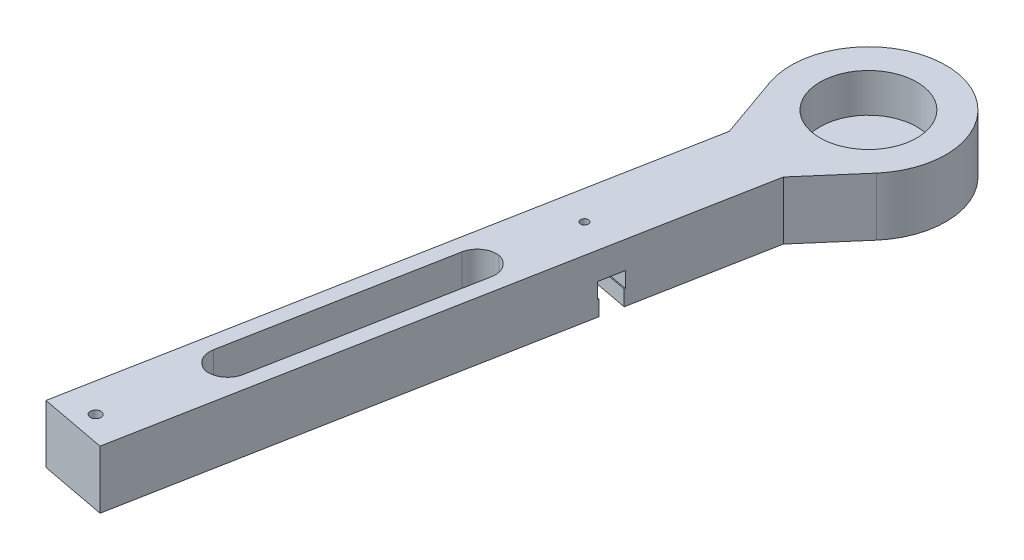
ISO-10303-21;
HEADER;
FILE_DESCRIPTION(('STEP AP214'),'2;1');
FILE_NAME('part.step','',(''),(''),'','','');
FILE_SCHEMA(('AUTOMOTIVE_DESIGN { 1 0 10303 214 1 1 1 1 }'));
ENDSEC;
DATA;
#1=APPLICATION_CONTEXT('core data for automotive mechanical design processes');
#2=APPLICATION_PROTOCOL_DEFINITION('international standard','automotive_design',2000,#1);
#3=PRODUCT_CONTEXT('',#1,'mechanical');
#4=PRODUCT('Part','Part','',(#3));
#5=PRODUCT_RELATED_PRODUCT_CATEGORY('part','',(#4));
#6=PRODUCT_DEFINITION_FORMATION('','',#4);
#7=PRODUCT_DEFINITION_CONTEXT('part definition',#1,'design');
#8=PRODUCT_DEFINITION('design','',#6,#7);
#9=PRODUCT_DEFINITION_SHAPE('','',#8);
#10=(LENGTH_UNIT() NAMED_UNIT(*) SI_UNIT(.MILLI.,.METRE.));
#11=(NAMED_UNIT(*) PLANE_ANGLE_UNIT() SI_UNIT($,.RADIAN.));
#12=(NAMED_UNIT(*) SI_UNIT($,.STERADIAN.) SOLID_ANGLE_UNIT());
#13=UNCERTAINTY_MEASURE_WITH_UNIT(LENGTH_MEASURE(1.E-05),#10,'distance_accuracy_value','');
#14=(GEOMETRIC_REPRESENTATION_CONTEXT(3) GLOBAL_UNCERTAINTY_ASSIGNED_CONTEXT((#13)) GLOBAL_UNIT_ASSIGNED_CONTEXT((#10,
#11,#12)) REPRESENTATION_CONTEXT('',''));
#15=CARTESIAN_POINT('',(0.,0.,0.));
#16=DIRECTION('',(0.,0.,1.));
#17=DIRECTION('',(1.,0.,0.));
#18=AXIS2_PLACEMENT_3D('',#15,#16,#17);
#19=CARTESIAN_POINT('',(-236.612399312574,147.4,-18.5069319913055));
#20=DIRECTION('',(0.,-1.,0.));
#21=DIRECTION('',(-0.982620152551214,0.,-0.185627680587325));
#22=AXIS2_PLACEMENT_3D('',#19,#20,#21);
#23=CYLINDRICAL_SURFACE('',#22,5.6);
#24=DIRECTION('',(0.,-1.,0.));
#25=VECTOR('',#24,1.);
#26=CARTESIAN_POINT('',(-237.651914323863,125.4,-13.0042591370187));
#27=LINE('',#26,#25);
#28=CARTESIAN_POINT('',(-237.651914323863,125.4,-13.0042591370187));
#29=VERTEX_POINT('',#28);
#30=CARTESIAN_POINT('',(-237.651914323863,117.4,-13.0042591370186));
#31=VERTEX_POINT('',#30);
#32=EDGE_CURVE('E315',#29,#31,#27,.T.);
#33=ORIENTED_EDGE('',*,*,#32,.T.);
#34=CARTESIAN_POINT('',(-236.612399312574,117.4,-18.5069319913054));
#35=DIRECTION('',(0.,-1.,0.));
#36=DIRECTION('',(-0.982620152551214,0.,-0.185627680587325));
#37=AXIS2_PLACEMENT_3D('',#34,#35,#36);
#38=CIRCLE('',#37,5.6);
#39=CARTESIAN_POINT('',(-235.572884301285,117.4,-24.0096048455922));
#40=VERTEX_POINT('',#39);
#41=EDGE_CURVE('E375',#31,#40,#38,.T.);
#42=ORIENTED_EDGE('',*,*,#41,.T.);
#43=DIRECTION('',(0.,1.,0.));
#44=VECTOR('',#43,1.);
#45=CARTESIAN_POINT('',(-235.572884301285,117.4,-24.0096048455922));
#46=LINE('',#45,#44);
#47=CARTESIAN_POINT('',(-235.572884301285,125.4,-24.0096048455923));
#48=VERTEX_POINT('',#47);
#49=EDGE_CURVE('E318',#40,#48,#46,.T.);
#50=ORIENTED_EDGE('',*,*,#49,.T.);
#51=CARTESIAN_POINT('',(-236.612399312574,125.4,-18.5069319913055));
#52=DIRECTION('',(0.,1.,0.));
#53=DIRECTION('',(0.982620152551214,0.,0.185627680587325));
#54=AXIS2_PLACEMENT_3D('',#51,#52,#53);
#55=CIRCLE('',#54,5.6);
#56=EDGE_CURVE('E369',#29,#48,#55,.F.);
#57=ORIENTED_EDGE('',*,*,#56,.F.);
#58=EDGE_LOOP('',(#33,#42,#50,#57));
#59=FACE_BOUND('',#58,.T.);
#60=ADVANCED_FACE('F15',(#59),#23,.F.);
#61=CARTESIAN_POINT('',(-261.368402455663,147.400000000001,206.813706895547));
#62=DIRECTION('',(-0.185627680587325,0.,0.982620152551214));
#63=DIRECTION('',(0.982620152551214,0.,0.185627680587325));
#64=AXIS2_PLACEMENT_3D('',#61,#62,#63);
#65=PLANE('',#64);
#66=DIRECTION('',(-0.982620152551214,0.,-0.185627680587325));
#67=VECTOR('',#66,1.);
#68=CARTESIAN_POINT('',(-261.368402455663,117.400000000001,206.813706895547));
#69=LINE('',#68,#67);
#70=CARTESIAN_POINT('',(-261.368402455663,117.400000000001,206.813706895547));
#71=VERTEX_POINT('',#70);
#72=CARTESIAN_POINT('',(-295.760107794956,117.400000000001,200.316738074991));
#73=VERTEX_POINT('',#72);
#74=EDGE_CURVE('E378',#71,#73,#69,.T.);
#75=ORIENTED_EDGE('',*,*,#74,.F.);
#76=DIRECTION('',(0.,-1.,0.));
#77=VECTOR('',#76,1.);
#78=CARTESIAN_POINT('',(-261.368402455663,147.400000000001,206.813706895547));
#79=LINE('',#78,#77);
#80=CARTESIAN_POINT('',(-261.368402455663,147.400000000001,206.813706895547));
#81=VERTEX_POINT('',#80);
#82=EDGE_CURVE('E391',#81,#71,#79,.T.);
#83=ORIENTED_EDGE('',*,*,#82,.F.);
#84=DIRECTION('',(-0.982620152551214,0.,-0.185627680587325));
#85=VECTOR('',#84,1.);
#86=CARTESIAN_POINT('',(-261.368402455663,147.400000000001,206.813706895547));
#87=LINE('',#86,#85);
#88=CARTESIAN_POINT('',(-295.760107794956,147.400000000001,200.316738074991));
#89=VERTEX_POINT('',#88);
#90=EDGE_CURVE('E379',#81,#89,#87,.T.);
#91=ORIENTED_EDGE('',*,*,#90,.T.);
#92=DIRECTION('',(0.,-1.,0.));
#93=VECTOR('',#92,1.);
#94=CARTESIAN_POINT('',(-295.760107794956,147.400000000001,200.316738074991));
#95=LINE('',#94,#93);
#96=EDGE_CURVE('E386',#89,#73,#95,.T.);
#97=ORIENTED_EDGE('',*,*,#96,.T.);
#98=EDGE_LOOP('',(#75,#83,#91,#97));
#99=FACE_BOUND('',#98,.T.);
#100=ADVANCED_FACE('F466',(#99),#65,.T.);
#101=CARTESIAN_POINT('',(-261.368402455663,147.400000000001,206.813706895547));
#102=DIRECTION('',(-0.982620152551214,0.,-0.185627680587325));
#103=DIRECTION('',(-0.185627680587325,0.,0.982620152551214));
#104=AXIS2_PLACEMENT_3D('',#101,#102,#103);
#105=PLANE('',#104);
#106=DIRECTION('',(0.185627680587325,0.,-0.982620152551214));
#107=VECTOR('',#106,1.);
#108=CARTESIAN_POINT('',(-218.377031631639,125.4,-20.7611204353141));
#109=LINE('',#108,#107);
#110=CARTESIAN_POINT('',(-218.377031631639,125.4,-20.7611204353141));
#111=VERTEX_POINT('',#110);
#112=CARTESIAN_POINT('',(-218.284217791345,125.4,-21.2524305115897));
#113=VERTEX_POINT('',#112);
#114=EDGE_CURVE('E332',#111,#113,#109,.T.);
#115=ORIENTED_EDGE('',*,*,#114,.F.);
#116=DIRECTION('',(0.,1.,0.));
#117=VECTOR('',#116,1.);
#118=CARTESIAN_POINT('',(-218.377031631639,117.4,-20.7611204353141));
#119=LINE('',#118,#117);
#120=CARTESIAN_POINT('',(-218.377031631639,117.4,-20.7611204353141));
#121=VERTEX_POINT('',#120);
#122=EDGE_CURVE('E204',#121,#111,#119,.T.);
#123=ORIENTED_EDGE('',*,*,#122,.F.);
#124=DIRECTION('',(0.185627680587325,0.,-0.982620152551214));
#125=VECTOR('',#124,1.);
#126=CARTESIAN_POINT('',(-261.368402455663,117.400000000001,206.813706895547));
#127=LINE('',#126,#125);
#128=CARTESIAN_POINT('',(-205.308842918292,117.4,-89.9375791749195));
#129=VERTEX_POINT('',#128);
#130=EDGE_CURVE('E196',#121,#129,#127,.T.);
#131=ORIENTED_EDGE('',*,*,#130,.T.);
#132=DIRECTION('',(0.,-1.,0.));
#133=VECTOR('',#132,1.);
#134=CARTESIAN_POINT('',(-205.308842918291,147.4,-89.9375791749196));
#135=LINE('',#134,#133);
#136=CARTESIAN_POINT('',(-205.308842918291,147.4,-89.9375791749196));
#137=VERTEX_POINT('',#136);
#138=EDGE_CURVE('E201',#137,#129,#135,.T.);
#139=ORIENTED_EDGE('',*,*,#138,.F.);
#140=DIRECTION('',(0.185627680587325,0.,-0.982620152551214));
#141=VECTOR('',#140,1.);
#142=CARTESIAN_POINT('',(-261.368402455663,147.400000000001,206.813706895547));
#143=LINE('',#142,#141);
#144=EDGE_CURVE('E384',#81,#137,#143,.T.);
#145=ORIENTED_EDGE('',*,*,#144,.F.);
#146=ORIENTED_EDGE('',*,*,#82,.T.);
#147=CARTESIAN_POINT('',(-220.456061654217,117.4,-9.75577472674047));
#148=VERTEX_POINT('',#147);
#149=EDGE_CURVE('E208',#71,#148,#127,.T.);
#150=ORIENTED_EDGE('',*,*,#149,.T.);
#151=DIRECTION('',(0.,-1.,0.));
#152=VECTOR('',#151,1.);
#153=CARTESIAN_POINT('',(-220.456061654217,125.4,-9.75577472674049));
#154=LINE('',#153,#152);
#155=CARTESIAN_POINT('',(-220.456061654217,125.4,-9.75577472674049));
#156=VERTEX_POINT('',#155);
#157=EDGE_CURVE('E329',#156,#148,#154,.T.);
#158=ORIENTED_EDGE('',*,*,#157,.F.);
#159=DIRECTION('',(0.185627680587325,0.,-0.982620152551214));
#160=VECTOR('',#159,1.);
#161=CARTESIAN_POINT('',(-220.548875494511,125.4,-9.26446465046488));
#162=LINE('',#161,#160);
#163=CARTESIAN_POINT('',(-220.548875494511,125.4,-9.26446465046488));
#164=VERTEX_POINT('',#163);
#165=EDGE_CURVE('E326',#164,#156,#162,.T.);
#166=ORIENTED_EDGE('',*,*,#165,.F.);
#167=DIRECTION('',(0.,-1.,0.));
#168=VECTOR('',#167,1.);
#169=CARTESIAN_POINT('',(-220.548875494511,125.4,-9.26446465046488));
#170=LINE('',#169,#168);
#171=CARTESIAN_POINT('',(-220.548875494511,133.4,-9.26446465046489));
#172=VERTEX_POINT('',#171);
#173=EDGE_CURVE('E323',#172,#164,#170,.T.);
#174=ORIENTED_EDGE('',*,*,#173,.F.);
#175=DIRECTION('',(-0.185627680587325,0.,0.982620152551214));
#176=VECTOR('',#175,1.);
#177=CARTESIAN_POINT('',(-219.416546642928,133.4,-15.2584475810273));
#178=LINE('',#177,#176);
#179=CARTESIAN_POINT('',(-218.284217791345,133.4,-21.2524305115897));
#180=VERTEX_POINT('',#179);
#181=EDGE_CURVE('E319',#180,#172,#178,.T.);
#182=ORIENTED_EDGE('',*,*,#181,.F.);
#183=DIRECTION('',(0.,1.,0.));
#184=VECTOR('',#183,1.);
#185=CARTESIAN_POINT('',(-218.284217791345,125.4,-21.2524305115897));
#186=LINE('',#185,#184);
#187=EDGE_CURVE('E335',#113,#180,#186,.T.);
#188=ORIENTED_EDGE('',*,*,#187,.F.);
#189=EDGE_LOOP('',(#115,#123,#131,#139,#145,#146,#150,#158,#166,#174,#182,#188));
#190=FACE_BOUND('',#189,.T.);
#191=ADVANCED_FACE('F199',(#190),#105,.F.);
#192=CARTESIAN_POINT('',(-295.760107794956,147.400000000001,200.316738074991));
#193=DIRECTION('',(-0.982620152551214,0.,-0.185627680587324));
#194=DIRECTION('',(-0.185627680587324,0.,0.982620152551214));
#195=AXIS2_PLACEMENT_3D('',#192,#193,#194);
#196=PLANE('',#195);
#197=DIRECTION('',(0.185627680587324,0.,-0.982620152551214));
#198=VECTOR('',#197,1.);
#199=CARTESIAN_POINT('',(-295.760107794956,117.400000000001,200.316738074991));
#200=LINE('',#199,#198);
#201=CARTESIAN_POINT('',(-239.700548257584,117.4,-96.4345479954759));
#202=VERTEX_POINT('',#201);
#203=EDGE_CURVE('E209',#73,#202,#200,.T.);
#204=ORIENTED_EDGE('',*,*,#203,.F.);
#205=ORIENTED_EDGE('',*,*,#96,.F.);
#206=DIRECTION('',(0.185627680587324,0.,-0.982620152551214));
#207=VECTOR('',#206,1.);
#208=CARTESIAN_POINT('',(-295.760107794956,147.400000000001,200.316738074991));
#209=LINE('',#208,#207);
#210=CARTESIAN_POINT('',(-239.700548257584,147.4,-96.4345479954759));
#211=VERTEX_POINT('',#210);
#212=EDGE_CURVE('E382',#89,#211,#209,.T.);
#213=ORIENTED_EDGE('',*,*,#212,.T.);
#214=DIRECTION('',(0.,1.,0.));
#215=VECTOR('',#214,1.);
#216=CARTESIAN_POINT('',(-239.700548257584,117.4,-96.4345479954759));
#217=LINE('',#216,#215);
#218=EDGE_CURVE('E218',#202,#211,#217,.T.);
#219=ORIENTED_EDGE('',*,*,#218,.F.);
#220=EDGE_LOOP('',(#204,#205,#213,#219));
#221=FACE_BOUND('',#220,.T.);
#222=ADVANCED_FACE('F451',(#221),#196,.T.);
#223=CARTESIAN_POINT('',(-232.71421802024,147.4,-39.141955194881));
#224=DIRECTION('',(0.,-1.,0.));
#225=DIRECTION('',(-0.982620152551214,0.,-0.185627680587325));
#226=AXIS2_PLACEMENT_3D('',#223,#224,#225);
#227=PLANE('',#226);
#228=CARTESIAN_POINT('',(-213.315929737555,147.4,-141.826796869654));
#229=DIRECTION('',(0.,1.,0.));
#230=DIRECTION('',(0.982620152551214,0.,0.185627680587325));
#231=AXIS2_PLACEMENT_3D('',#228,#229,#230);
#232=CIRCLE('',#231,25.);
#233=CARTESIAN_POINT('',(-188.750425923775,147.4,-137.186104854971));
#234=VERTEX_POINT('',#233);
#235=EDGE_CURVE('E762',#234,#234,#232,.T.);
#236=ORIENTED_EDGE('',*,*,#235,.F.);
#237=EDGE_LOOP('',(#236));
#238=FACE_BOUND('',#237,.T.);
#239=DIRECTION('',(0.185627680587325,0.,-0.982620152551214));
#240=VECTOR('',#239,1.);
#241=CARTESIAN_POINT('',(-234.231826243996,147.4,20.2762985512784));
#242=LINE('',#241,#240);
#243=CARTESIAN_POINT('',(-256.445042960722,147.400000000001,137.861964276245));
#244=VERTEX_POINT('',#243);
#245=CARTESIAN_POINT('',(-236.08810304987,147.4,30.1025000767905));
#246=VERTEX_POINT('',#245);
#247=EDGE_CURVE('E252',#244,#246,#242,.T.);
#248=ORIENTED_EDGE('',*,*,#247,.F.);
#249=CARTESIAN_POINT('',(-266.271244486234,147.400000000001,136.005687470372));
#250=DIRECTION('',(0.,-1.,0.));
#251=DIRECTION('',(-0.982620152551214,0.,-0.185627680587325));
#252=AXIS2_PLACEMENT_3D('',#249,#250,#251);
#253=CIRCLE('',#252,10.);
#254=CARTESIAN_POINT('',(-267.672004997513,147.400000000001,145.907094945577));
#255=VERTEX_POINT('',#254);
#256=EDGE_CURVE('E24',#244,#255,#253,.T.);
#257=ORIENTED_EDGE('',*,*,#256,.T.);
#258=CARTESIAN_POINT('',(-265.364168570168,147.400000000001,136.177044019471));
#259=DIRECTION('',(0.,-1.,0.));
#260=DIRECTION('',(-0.982620152551214,0.,-0.185627680587325));
#261=AXIS2_PLACEMENT_3D('',#258,#259,#260);
#262=CIRCLE('',#261,10.);
#263=CARTESIAN_POINT('',(-275.190370095681,147.400000000001,134.320767213597));
#264=VERTEX_POINT('',#263);
#265=EDGE_CURVE('E419',#255,#264,#262,.T.);
#266=ORIENTED_EDGE('',*,*,#265,.T.);
#267=DIRECTION('',(-0.185627680587325,0.,0.982620152551214));
#268=VECTOR('',#267,1.);
#269=CARTESIAN_POINT('',(-252.977153378955,147.4,16.7351014886305));
#270=LINE('',#269,#268);
#271=CARTESIAN_POINT('',(-254.833430184828,147.4,26.5613030141426));
#272=VERTEX_POINT('',#271);
#273=EDGE_CURVE('E249',#272,#264,#270,.T.);
#274=ORIENTED_EDGE('',*,*,#273,.F.);
#275=CARTESIAN_POINT('',(-245.007228659316,147.4,28.4175798200159));
#276=DIRECTION('',(0.,-1.,0.));
#277=DIRECTION('',(-0.982620152551214,0.,-0.185627680587325));
#278=AXIS2_PLACEMENT_3D('',#275,#276,#277);
#279=CIRCLE('',#278,10.);
#280=CARTESIAN_POINT('',(-243.606468148037,147.4,18.5161723448111));
#281=VERTEX_POINT('',#280);
#282=EDGE_CURVE('E415',#272,#281,#279,.T.);
#283=ORIENTED_EDGE('',*,*,#282,.T.);
#284=CARTESIAN_POINT('',(-245.914304575382,147.4,28.2462232709173));
#285=DIRECTION('',(0.,-1.,0.));
#286=DIRECTION('',(-0.982620152551214,0.,-0.185627680587325));
#287=AXIS2_PLACEMENT_3D('',#284,#285,#286);
#288=CIRCLE('',#287,10.);
#289=EDGE_CURVE('E411',#281,#246,#288,.T.);
#290=ORIENTED_EDGE('',*,*,#289,.T.);
#291=EDGE_LOOP('',(#248,#257,#266,#274,#283,#290));
#292=FACE_BOUND('',#291,.T.);
#293=CARTESIAN_POINT('',(-276.707978319436,147.400000000001,193.739020959757));
#294=DIRECTION('',(0.,1.,0.));
#295=DIRECTION('',(0.982620152551214,0.,0.185627680587325));
#296=AXIS2_PLACEMENT_3D('',#293,#294,#295);
#297=CIRCLE('',#296,2.75000000000001);
#298=CARTESIAN_POINT('',(-274.005772899921,147.400000000001,194.249497081372));
#299=VERTEX_POINT('',#298);
#300=EDGE_CURVE('E308',#299,#299,#297,.T.);
#301=ORIENTED_EDGE('',*,*,#300,.F.);
#302=EDGE_LOOP('',(#301));
#303=FACE_BOUND('',#302,.T.);
#304=CARTESIAN_POINT('',(-236.612399312574,147.4,-18.5069319913055));
#305=DIRECTION('',(0.,1.,0.));
#306=DIRECTION('',(0.982620152551214,0.,0.185627680587325));
#307=AXIS2_PLACEMENT_3D('',#304,#305,#306);
#308=CIRCLE('',#307,2.);
#309=CARTESIAN_POINT('',(-234.647159007472,147.4,-18.1356766301308));
#310=VERTEX_POINT('',#309);
#311=EDGE_CURVE('E311',#310,#310,#308,.T.);
#312=ORIENTED_EDGE('',*,*,#311,.F.);
#313=EDGE_LOOP('',(#312));
#314=FACE_BOUND('',#313,.T.);
#315=ORIENTED_EDGE('',*,*,#144,.T.);
#316=DIRECTION('',(0.654158657360936,0.,-0.756357356677211));
#317=VECTOR('',#316,1.);
#318=CARTESIAN_POINT('',(-205.308842918291,147.4,-89.9375791749196));
#319=LINE('',#318,#317);
#320=CARTESIAN_POINT('',(-183.061635470467,147.4,-115.660450575217));
#321=VERTEX_POINT('',#320);
#322=EDGE_CURVE('E217',#137,#321,#319,.T.);
#323=ORIENTED_EDGE('',*,*,#322,.T.);
#324=CARTESIAN_POINT('',(-213.315929737555,147.4,-141.826796869654));
#325=DIRECTION('',(0.,1.,0.));
#326=DIRECTION('',(0.982620152551214,0.,0.185627680587325));
#327=AXIS2_PLACEMENT_3D('',#324,#325,#326);
#328=CIRCLE('',#327,40.);
#329=CARTESIAN_POINT('',(-251.030802715791,147.4,-128.500568737299));
#330=VERTEX_POINT('',#329);
#331=EDGE_CURVE('E229',#321,#330,#328,.T.);
#332=ORIENTED_EDGE('',*,*,#331,.T.);
#333=DIRECTION('',(0.333155703308865,0.,0.942871824455889));
#334=VECTOR('',#333,1.);
#335=CARTESIAN_POINT('',(-251.030802715791,147.4,-128.500568737299));
#336=LINE('',#335,#334);
#337=EDGE_CURVE('E233',#330,#211,#336,.T.);
#338=ORIENTED_EDGE('',*,*,#337,.T.);
#339=ORIENTED_EDGE('',*,*,#212,.F.);
#340=ORIENTED_EDGE('',*,*,#90,.F.);
#341=EDGE_LOOP('',(#315,#323,#332,#338,#339,#340));
#342=FACE_BOUND('',#341,.T.);
#343=ADVANCED_FACE('F448',(#238,#292,#303,#314,#342),#227,.F.);
#344=CARTESIAN_POINT('',(-232.714218020241,117.4,-39.1419551948809));
#345=DIRECTION('',(0.,-1.,0.));
#346=DIRECTION('',(-0.982620152551214,0.,-0.185627680587325));
#347=AXIS2_PLACEMENT_3D('',#344,#345,#346);
#348=PLANE('',#347);
#349=CARTESIAN_POINT('',(-265.364168570168,117.400000000001,136.177044019471));
#350=DIRECTION('',(0.,-1.,0.));
#351=DIRECTION('',(-0.982620152551214,0.,-0.185627680587325));
#352=AXIS2_PLACEMENT_3D('',#349,#350,#351);
#353=CIRCLE('',#352,10.);
#354=CARTESIAN_POINT('',(-275.190370095681,117.400000000001,134.320767213597));
#355=VERTEX_POINT('',#354);
#356=CARTESIAN_POINT('',(-267.672004997513,117.400000000001,145.907094945577));
#357=VERTEX_POINT('',#356);
#358=EDGE_CURVE('E31',#355,#357,#353,.F.);
#359=ORIENTED_EDGE('',*,*,#358,.T.);
#360=CARTESIAN_POINT('',(-266.271244486234,117.400000000001,136.005687470372));
#361=DIRECTION('',(0.,-1.,0.));
#362=DIRECTION('',(-0.982620152551214,0.,-0.185627680587325));
#363=AXIS2_PLACEMENT_3D('',#360,#361,#362);
#364=CIRCLE('',#363,10.);
#365=CARTESIAN_POINT('',(-256.445042960722,117.400000000001,137.861964276245));
#366=VERTEX_POINT('',#365);
#367=EDGE_CURVE('E10',#357,#366,#364,.F.);
#368=ORIENTED_EDGE('',*,*,#367,.T.);
#369=DIRECTION('',(0.185627680587325,0.,-0.982620152551214));
#370=VECTOR('',#369,1.);
#371=CARTESIAN_POINT('',(-234.231826243996,117.4,20.2762985512784));
#372=LINE('',#371,#370);
#373=CARTESIAN_POINT('',(-236.08810304987,117.4,30.1025000767906));
#374=VERTEX_POINT('',#373);
#375=EDGE_CURVE('E245',#366,#374,#372,.T.);
#376=ORIENTED_EDGE('',*,*,#375,.T.);
#377=CARTESIAN_POINT('',(-245.914304575382,117.4,28.2462232709173));
#378=DIRECTION('',(0.,-1.,0.));
#379=DIRECTION('',(-0.982620152551214,0.,-0.185627680587325));
#380=AXIS2_PLACEMENT_3D('',#377,#378,#379);
#381=CIRCLE('',#380,10.);
#382=CARTESIAN_POINT('',(-243.606468148037,117.4,18.5161723448111));
#383=VERTEX_POINT('',#382);
#384=EDGE_CURVE('E413',#374,#383,#381,.F.);
#385=ORIENTED_EDGE('',*,*,#384,.T.);
#386=CARTESIAN_POINT('',(-245.007228659316,117.4,28.4175798200159));
#387=DIRECTION('',(0.,-1.,0.));
#388=DIRECTION('',(-0.982620152551214,0.,-0.185627680587325));
#389=AXIS2_PLACEMENT_3D('',#386,#387,#388);
#390=CIRCLE('',#389,10.);
#391=CARTESIAN_POINT('',(-254.833430184828,117.4,26.5613030141427));
#392=VERTEX_POINT('',#391);
#393=EDGE_CURVE('E417',#383,#392,#390,.F.);
#394=ORIENTED_EDGE('',*,*,#393,.T.);
#395=DIRECTION('',(-0.185627680587325,0.,0.982620152551214));
#396=VECTOR('',#395,1.);
#397=CARTESIAN_POINT('',(-252.977153378955,117.4,16.7351014886305));
#398=LINE('',#397,#396);
#399=EDGE_CURVE('E248',#392,#355,#398,.T.);
#400=ORIENTED_EDGE('',*,*,#399,.T.);
#401=EDGE_LOOP('',(#359,#368,#376,#385,#394,#400));
#402=FACE_BOUND('',#401,.T.);
#403=DIRECTION('',(-0.990246695167479,0.,-0.139325097200347));
#404=VECTOR('',#403,1.);
#405=CARTESIAN_POINT('',(-274.870303399457,117.400000000001,198.289436789306));
#406=LINE('',#405,#404);
#407=CARTESIAN_POINT('',(-274.870303399457,117.400000000001,198.289436789306));
#408=VERTEX_POINT('',#407);
#409=CARTESIAN_POINT('',(-279.729916565619,117.400000000001,197.605702039131));
#410=VERTEX_POINT('',#409);
#411=EDGE_CURVE('E270',#408,#410,#406,.T.);
#412=ORIENTED_EDGE('',*,*,#411,.F.);
#413=DIRECTION('',(-0.61578242114398,0.,0.787916245428446));
#414=VECTOR('',#413,1.);
#415=CARTESIAN_POINT('',(-271.848365153274,117.400000000001,194.422755709931));
#416=LINE('',#415,#414);
#417=CARTESIAN_POINT('',(-271.848365153274,117.400000000001,194.422755709931));
#418=VERTEX_POINT('',#417);
#419=EDGE_CURVE('E251',#418,#408,#416,.T.);
#420=ORIENTED_EDGE('',*,*,#419,.F.);
#421=DIRECTION('',(0.374464274023497,0.,0.927241342628798));
#422=VECTOR('',#421,1.);
#423=CARTESIAN_POINT('',(-273.686040073254,117.400000000001,189.872339880382));
#424=LINE('',#423,#422);
#425=CARTESIAN_POINT('',(-273.686040073254,117.400000000001,189.872339880382));
#426=VERTEX_POINT('',#425);
#427=EDGE_CURVE('E258',#426,#418,#424,.T.);
#428=ORIENTED_EDGE('',*,*,#427,.F.);
#429=DIRECTION('',(0.990246695167479,0.,0.139325097200347));
#430=VECTOR('',#429,1.);
#431=CARTESIAN_POINT('',(-278.545653239416,117.400000000001,189.188605130208));
#432=LINE('',#431,#430);
#433=CARTESIAN_POINT('',(-278.545653239416,117.400000000001,189.188605130208));
#434=VERTEX_POINT('',#433);
#435=EDGE_CURVE('E261',#434,#426,#432,.T.);
#436=ORIENTED_EDGE('',*,*,#435,.F.);
#437=DIRECTION('',(0.61578242114398,0.,-0.787916245428446));
#438=VECTOR('',#437,1.);
#439=CARTESIAN_POINT('',(-281.567591485599,117.400000000001,193.055286209582));
#440=LINE('',#439,#438);
#441=CARTESIAN_POINT('',(-281.567591485599,117.400000000001,193.055286209582));
#442=VERTEX_POINT('',#441);
#443=EDGE_CURVE('E264',#442,#434,#440,.T.);
#444=ORIENTED_EDGE('',*,*,#443,.F.);
#445=DIRECTION('',(-0.374464274023499,0.,-0.927241342628797));
#446=VECTOR('',#445,1.);
#447=CARTESIAN_POINT('',(-279.729916565619,117.400000000001,197.605702039131));
#448=LINE('',#447,#446);
#449=EDGE_CURVE('E267',#410,#442,#448,.T.);
#450=ORIENTED_EDGE('',*,*,#449,.F.);
#451=EDGE_LOOP('',(#412,#420,#428,#436,#444,#450));
#452=FACE_BOUND('',#451,.T.);
#453=DIRECTION('',(0.982620152551214,0.,0.185627680587325));
#454=VECTOR('',#453,1.);
#455=CARTESIAN_POINT('',(-235.572884301285,117.4,-24.0096048455922));
#456=LINE('',#455,#454);
#457=EDGE_CURVE('E343',#40,#121,#456,.T.);
#458=ORIENTED_EDGE('',*,*,#457,.F.);
#459=ORIENTED_EDGE('',*,*,#41,.F.);
#460=DIRECTION('',(0.982620152551214,0.,0.185627680587325));
#461=VECTOR('',#460,1.);
#462=CARTESIAN_POINT('',(-237.651914323863,117.4,-13.0042591370186));
#463=LINE('',#462,#461);
#464=EDGE_CURVE('E345',#31,#148,#463,.T.);
#465=ORIENTED_EDGE('',*,*,#464,.T.);
#466=ORIENTED_EDGE('',*,*,#149,.F.);
#467=ORIENTED_EDGE('',*,*,#74,.T.);
#468=ORIENTED_EDGE('',*,*,#203,.T.);
#469=DIRECTION('',(0.333155703308865,0.,0.942871824455889));
#470=VECTOR('',#469,1.);
#471=CARTESIAN_POINT('',(-251.030802715791,117.4,-128.500568737299));
#472=LINE('',#471,#470);
#473=CARTESIAN_POINT('',(-251.030802715791,117.4,-128.500568737299));
#474=VERTEX_POINT('',#473);
#475=EDGE_CURVE('E224',#474,#202,#472,.T.);
#476=ORIENTED_EDGE('',*,*,#475,.F.);
#477=CARTESIAN_POINT('',(-213.315929737555,117.4,-141.826796869654));
#478=DIRECTION('',(0.,1.,0.));
#479=DIRECTION('',(0.982620152551214,0.,0.185627680587325));
#480=AXIS2_PLACEMENT_3D('',#477,#478,#479);
#481=CIRCLE('',#480,40.);
#482=CARTESIAN_POINT('',(-183.061635470467,117.4,-115.660450575216));
#483=VERTEX_POINT('',#482);
#484=EDGE_CURVE('E223',#483,#474,#481,.T.);
#485=ORIENTED_EDGE('',*,*,#484,.F.);
#486=DIRECTION('',(0.654158657360936,0.,-0.756357356677211));
#487=VECTOR('',#486,1.);
#488=CARTESIAN_POINT('',(-205.308842918292,117.4,-89.9375791749195));
#489=LINE('',#488,#487);
#490=EDGE_CURVE('E214',#129,#483,#489,.T.);
#491=ORIENTED_EDGE('',*,*,#490,.F.);
#492=ORIENTED_EDGE('',*,*,#130,.F.);
#493=EDGE_LOOP('',(#458,#459,#465,#466,#467,#468,#476,#485,#491,#492));
#494=FACE_BOUND('',#493,.T.);
#495=ADVANCED_FACE('F220',(#402,#452,#494),#348,.T.);
#496=CARTESIAN_POINT('',(-232.714218020241,125.4,-39.1419551948809));
#497=DIRECTION('',(0.,1.,0.));
#498=DIRECTION('',(0.982620152551214,0.,0.185627680587325));
#499=AXIS2_PLACEMENT_3D('',#496,#497,#498);
#500=PLANE('',#499);
#501=DIRECTION('',(0.982620152551214,0.,0.185627680587325));
#502=VECTOR('',#501,1.);
#503=CARTESIAN_POINT('',(-235.572884301285,125.4,-24.0096048455923));
#504=LINE('',#503,#502);
#505=EDGE_CURVE('E340',#48,#111,#504,.T.);
#506=ORIENTED_EDGE('',*,*,#505,.T.);
#507=ORIENTED_EDGE('',*,*,#114,.T.);
#508=DIRECTION('',(-0.982620152551214,0.,-0.185627680587325));
#509=VECTOR('',#508,1.);
#510=CARTESIAN_POINT('',(-232.019442802513,125.4,-23.8471645545954));
#511=LINE('',#510,#509);
#512=CARTESIAN_POINT('',(-238.94069811947,125.4,-25.1546652891403));
#513=VERTEX_POINT('',#512);
#514=EDGE_CURVE('E355',#113,#513,#511,.T.);
#515=ORIENTED_EDGE('',*,*,#514,.T.);
#516=DIRECTION('',(-0.652068363309814,0.,0.758160174086229));
#517=VECTOR('',#516,1.);
#518=CARTESIAN_POINT('',(-238.94069811947,125.4,-25.1546652891403));
#519=LINE('',#518,#517);
#520=CARTESIAN_POINT('',(-243.533654629531,125.4,-19.8144327258503));
#521=VERTEX_POINT('',#520);
#522=EDGE_CURVE('E357',#513,#521,#519,.T.);
#523=ORIENTED_EDGE('',*,*,#522,.T.);
#524=DIRECTION('',(0.3305517892414,0.,0.943787854673554));
#525=VECTOR('',#524,1.);
#526=CARTESIAN_POINT('',(-243.533654629531,125.4,-19.8144327258503));
#527=LINE('',#526,#525);
#528=CARTESIAN_POINT('',(-241.205355822635,125.4,-13.1666994280155));
#529=VERTEX_POINT('',#528);
#530=EDGE_CURVE('E360',#521,#529,#527,.T.);
#531=ORIENTED_EDGE('',*,*,#530,.T.);
#532=DIRECTION('',(0.982620152551214,0.,0.185627680587324));
#533=VECTOR('',#532,1.);
#534=CARTESIAN_POINT('',(-241.205355822635,125.4,-13.1666994280155));
#535=LINE('',#534,#533);
#536=EDGE_CURVE('E363',#529,#164,#535,.T.);
#537=ORIENTED_EDGE('',*,*,#536,.T.);
#538=ORIENTED_EDGE('',*,*,#165,.T.);
#539=DIRECTION('',(0.982620152551214,0.,0.185627680587325));
#540=VECTOR('',#539,1.);
#541=CARTESIAN_POINT('',(-237.651914323863,125.4,-13.0042591370187));
#542=LINE('',#541,#540);
#543=EDGE_CURVE('E322',#29,#156,#542,.T.);
#544=ORIENTED_EDGE('',*,*,#543,.F.);
#545=ORIENTED_EDGE('',*,*,#56,.T.);
#546=EDGE_LOOP('',(#506,#507,#515,#523,#531,#537,#538,#544,#545));
#547=FACE_BOUND('',#546,.T.);
#548=ADVANCED_FACE('F498',(#547),#500,.T.);
#549=CARTESIAN_POINT('',(-232.019442802513,125.4,-23.8471645545954));
#550=DIRECTION('',(0.185627680587325,0.,-0.982620152551214));
#551=DIRECTION('',(-0.982620152551214,0.,-0.185627680587325));
#552=AXIS2_PLACEMENT_3D('',#549,#550,#551);
#553=PLANE('',#552);
#554=DIRECTION('',(-0.982620152551214,0.,-0.185627680587325));
#555=VECTOR('',#554,1.);
#556=CARTESIAN_POINT('',(-232.019442802513,133.4,-23.8471645545954));
#557=LINE('',#556,#555);
#558=CARTESIAN_POINT('',(-238.94069811947,133.4,-25.1546652891403));
#559=VERTEX_POINT('',#558);
#560=EDGE_CURVE('E353',#180,#559,#557,.T.);
#561=ORIENTED_EDGE('',*,*,#560,.T.);
#562=DIRECTION('',(0.,1.,0.));
#563=VECTOR('',#562,1.);
#564=CARTESIAN_POINT('',(-238.94069811947,125.4,-25.1546652891403));
#565=LINE('',#564,#563);
#566=EDGE_CURVE('E365',#513,#559,#565,.T.);
#567=ORIENTED_EDGE('',*,*,#566,.F.);
#568=ORIENTED_EDGE('',*,*,#514,.F.);
#569=ORIENTED_EDGE('',*,*,#187,.T.);
#570=EDGE_LOOP('',(#561,#567,#568,#569));
#571=FACE_BOUND('',#570,.T.);
#572=ADVANCED_FACE('F493',(#571),#553,.F.);
#573=CARTESIAN_POINT('',(-241.205355822635,125.4,-13.1666994280155));
#574=DIRECTION('',(-0.185627680587325,0.,0.982620152551214));
#575=DIRECTION('',(0.982620152551214,0.,0.185627680587325));
#576=AXIS2_PLACEMENT_3D('',#573,#574,#575);
#577=PLANE('',#576);
#578=ORIENTED_EDGE('',*,*,#173,.T.);
#579=ORIENTED_EDGE('',*,*,#536,.F.);
#580=DIRECTION('',(0.,1.,0.));
#581=VECTOR('',#580,1.);
#582=CARTESIAN_POINT('',(-241.205355822635,125.4,-13.1666994280155));
#583=LINE('',#582,#581);
#584=CARTESIAN_POINT('',(-241.205355822635,133.4,-13.1666994280155));
#585=VERTEX_POINT('',#584);
#586=EDGE_CURVE('E366',#529,#585,#583,.T.);
#587=ORIENTED_EDGE('',*,*,#586,.T.);
#588=DIRECTION('',(0.982620152551214,0.,0.185627680587325));
#589=VECTOR('',#588,1.);
#590=CARTESIAN_POINT('',(-241.205355822635,133.4,-13.1666994280155));
#591=LINE('',#590,#589);
#592=EDGE_CURVE('E351',#585,#172,#591,.T.);
#593=ORIENTED_EDGE('',*,*,#592,.T.);
#594=EDGE_LOOP('',(#578,#579,#587,#593));
#595=FACE_BOUND('',#594,.T.);
#596=ADVANCED_FACE('F566',(#595),#577,.F.);
#597=CARTESIAN_POINT('',(-243.533654629531,125.4,-19.8144327258503));
#598=DIRECTION('',(-0.943787854673554,0.,0.3305517892414));
#599=DIRECTION('',(0.3305517892414,0.,0.943787854673554));
#600=AXIS2_PLACEMENT_3D('',#597,#598,#599);
#601=PLANE('',#600);
#602=DIRECTION('',(0.,1.,0.));
#603=VECTOR('',#602,1.);
#604=CARTESIAN_POINT('',(-243.533654629531,125.4,-19.8144327258503));
#605=LINE('',#604,#603);
#606=CARTESIAN_POINT('',(-243.533654629531,133.4,-19.8144327258503));
#607=VERTEX_POINT('',#606);
#608=EDGE_CURVE('E370',#521,#607,#605,.T.);
#609=ORIENTED_EDGE('',*,*,#608,.T.);
#610=DIRECTION('',(0.3305517892414,0.,0.943787854673554));
#611=VECTOR('',#610,1.);
#612=CARTESIAN_POINT('',(-243.533654629531,133.4,-19.8144327258503));
#613=LINE('',#612,#611);
#614=EDGE_CURVE('E342',#607,#585,#613,.T.);
#615=ORIENTED_EDGE('',*,*,#614,.T.);
#616=ORIENTED_EDGE('',*,*,#586,.F.);
#617=ORIENTED_EDGE('',*,*,#530,.F.);
#618=EDGE_LOOP('',(#609,#615,#616,#617));
#619=FACE_BOUND('',#618,.T.);
#620=ADVANCED_FACE('F569',(#619),#601,.F.);
#621=CARTESIAN_POINT('',(-238.94069811947,125.4,-25.1546652891403));
#622=DIRECTION('',(-0.758160174086229,0.,-0.652068363309813));
#623=DIRECTION('',(-0.652068363309813,0.,0.758160174086229));
#624=AXIS2_PLACEMENT_3D('',#621,#622,#623);
#625=PLANE('',#624);
#626=ORIENTED_EDGE('',*,*,#566,.T.);
#627=DIRECTION('',(-0.652068363309813,0.,0.758160174086229));
#628=VECTOR('',#627,1.);
#629=CARTESIAN_POINT('',(-238.94069811947,133.4,-25.1546652891403));
#630=LINE('',#629,#628);
#631=EDGE_CURVE('E393',#559,#607,#630,.T.);
#632=ORIENTED_EDGE('',*,*,#631,.T.);
#633=ORIENTED_EDGE('',*,*,#608,.F.);
#634=ORIENTED_EDGE('',*,*,#522,.F.);
#635=EDGE_LOOP('',(#626,#632,#633,#634));
#636=FACE_BOUND('',#635,.T.);
#637=ADVANCED_FACE('F561',(#636),#625,.F.);
#638=CARTESIAN_POINT('',(-228.91652629431,133.4,0.247585724037692));
#639=DIRECTION('',(0.,-1.,0.));
#640=DIRECTION('',(-0.982620152551214,0.,-0.185627680587325));
#641=AXIS2_PLACEMENT_3D('',#638,#639,#640);
#642=PLANE('',#641);
#643=CARTESIAN_POINT('',(-236.612399312574,133.4,-18.5069319913055));
#644=DIRECTION('',(0.,-1.,0.));
#645=DIRECTION('',(-0.982620152551214,0.,-0.185627680587325));
#646=AXIS2_PLACEMENT_3D('',#643,#644,#645);
#647=CIRCLE('',#646,2.);
#648=CARTESIAN_POINT('',(-238.577639617677,133.4,-18.8781873524801));
#649=VERTEX_POINT('',#648);
#650=EDGE_CURVE('E314',#649,#649,#647,.T.);
#651=ORIENTED_EDGE('',*,*,#650,.F.);
#652=EDGE_LOOP('',(#651));
#653=FACE_BOUND('',#652,.T.);
#654=ORIENTED_EDGE('',*,*,#560,.F.);
#655=ORIENTED_EDGE('',*,*,#181,.T.);
#656=ORIENTED_EDGE('',*,*,#592,.F.);
#657=ORIENTED_EDGE('',*,*,#614,.F.);
#658=ORIENTED_EDGE('',*,*,#631,.F.);
#659=EDGE_LOOP('',(#654,#655,#656,#657,#658));
#660=FACE_BOUND('',#659,.T.);
#661=ADVANCED_FACE('F554',(#653,#660),#642,.T.);
#662=CARTESIAN_POINT('',(-235.572884301285,117.4,-24.0096048455922));
#663=DIRECTION('',(0.185627680587325,0.,-0.982620152551214));
#664=DIRECTION('',(-0.982620152551214,0.,-0.185627680587325));
#665=AXIS2_PLACEMENT_3D('',#662,#663,#664);
#666=PLANE('',#665);
#667=ORIENTED_EDGE('',*,*,#122,.T.);
#668=ORIENTED_EDGE('',*,*,#505,.F.);
#669=ORIENTED_EDGE('',*,*,#49,.F.);
#670=ORIENTED_EDGE('',*,*,#457,.T.);
#671=EDGE_LOOP('',(#667,#668,#669,#670));
#672=FACE_BOUND('',#671,.T.);
#673=ADVANCED_FACE('F551',(#672),#666,.F.);
#674=CARTESIAN_POINT('',(-237.651914323863,125.4,-13.0042591370187));
#675=DIRECTION('',(-0.185627680587325,0.,0.982620152551214));
#676=DIRECTION('',(0.982620152551214,0.,0.185627680587325));
#677=AXIS2_PLACEMENT_3D('',#674,#675,#676);
#678=PLANE('',#677);
#679=ORIENTED_EDGE('',*,*,#157,.T.);
#680=ORIENTED_EDGE('',*,*,#464,.F.);
#681=ORIENTED_EDGE('',*,*,#32,.F.);
#682=ORIENTED_EDGE('',*,*,#543,.T.);
#683=EDGE_LOOP('',(#679,#680,#681,#682));
#684=FACE_BOUND('',#683,.T.);
#685=ADVANCED_FACE('F549',(#684),#678,.F.);
#686=CARTESIAN_POINT('',(-236.612399312574,109.4,-18.5069319913054));
#687=DIRECTION('',(0.,1.,0.));
#688=DIRECTION('',(0.982620152551214,0.,0.185627680587325));
#689=AXIS2_PLACEMENT_3D('',#686,#687,#688);
#690=CYLINDRICAL_SURFACE('',#689,2.);
#691=ORIENTED_EDGE('',*,*,#650,.T.);
#692=EDGE_LOOP('',(#691));
#693=FACE_BOUND('',#692,.T.);
#694=ORIENTED_EDGE('',*,*,#311,.T.);
#695=EDGE_LOOP('',(#694));
#696=FACE_BOUND('',#695,.T.);
#697=ADVANCED_FACE('F545',(#693,#696),#690,.F.);
#698=CARTESIAN_POINT('',(-276.707978319436,138.400000000001,193.739020959757));
#699=DIRECTION('',(0.,1.,0.));
#700=DIRECTION('',(0.982620152551214,0.,0.185627680587325));
#701=AXIS2_PLACEMENT_3D('',#698,#699,#700);
#702=CYLINDRICAL_SURFACE('',#701,2.75000000000001);
#703=CARTESIAN_POINT('',(-276.707978319436,138.400000000001,193.739020959757));
#704=DIRECTION('',(0.,1.,0.));
#705=DIRECTION('',(0.982620152551214,0.,0.185627680587325));
#706=AXIS2_PLACEMENT_3D('',#703,#704,#705);
#707=CIRCLE('',#706,2.75000000000001);
#708=CARTESIAN_POINT('',(-274.005772899921,138.400000000001,194.249497081372));
#709=VERTEX_POINT('',#708);
#710=EDGE_CURVE('E305',#709,#709,#707,.T.);
#711=ORIENTED_EDGE('',*,*,#710,.F.);
#712=EDGE_LOOP('',(#711));
#713=FACE_BOUND('',#712,.T.);
#714=ORIENTED_EDGE('',*,*,#300,.T.);
#715=EDGE_LOOP('',(#714));
#716=FACE_BOUND('',#715,.T.);
#717=ADVANCED_FACE('F541',(#713,#716),#702,.F.);
#718=CARTESIAN_POINT('',(-276.707978319436,138.400000000001,193.739020959757));
#719=DIRECTION('',(0.,1.,0.));
#720=DIRECTION('',(0.982620152551214,0.,0.185627680587325));
#721=AXIS2_PLACEMENT_3D('',#718,#719,#720);
#722=PLANE('',#721);
#723=ORIENTED_EDGE('',*,*,#710,.T.);
#724=EDGE_LOOP('',(#723));
#725=FACE_BOUND('',#724,.T.);
#726=DIRECTION('',(-0.61578242114398,0.,0.787916245428446));
#727=VECTOR('',#726,1.);
#728=CARTESIAN_POINT('',(-271.848365153274,138.400000000001,194.422755709931));
#729=LINE('',#728,#727);
#730=CARTESIAN_POINT('',(-271.848365153274,138.400000000001,194.422755709931));
#731=VERTEX_POINT('',#730);
#732=CARTESIAN_POINT('',(-274.870303399457,138.400000000001,198.289436789306));
#733=VERTEX_POINT('',#732);
#734=EDGE_CURVE('E278',#731,#733,#729,.T.);
#735=ORIENTED_EDGE('',*,*,#734,.T.);
#736=DIRECTION('',(-0.990246695167479,0.,-0.139325097200347));
#737=VECTOR('',#736,1.);
#738=CARTESIAN_POINT('',(-274.870303399457,138.400000000001,198.289436789306));
#739=LINE('',#738,#737);
#740=CARTESIAN_POINT('',(-279.729916565619,138.400000000001,197.605702039131));
#741=VERTEX_POINT('',#740);
#742=EDGE_CURVE('E260',#733,#741,#739,.T.);
#743=ORIENTED_EDGE('',*,*,#742,.T.);
#744=DIRECTION('',(-0.374464274023499,0.,-0.927241342628798));
#745=VECTOR('',#744,1.);
#746=CARTESIAN_POINT('',(-279.729916565619,138.400000000001,197.605702039131));
#747=LINE('',#746,#745);
#748=CARTESIAN_POINT('',(-281.567591485599,138.400000000001,193.055286209582));
#749=VERTEX_POINT('',#748);
#750=EDGE_CURVE('E295',#741,#749,#747,.T.);
#751=ORIENTED_EDGE('',*,*,#750,.T.);
#752=DIRECTION('',(0.61578242114398,0.,-0.787916245428446));
#753=VECTOR('',#752,1.);
#754=CARTESIAN_POINT('',(-281.567591485599,138.400000000001,193.055286209582));
#755=LINE('',#754,#753);
#756=CARTESIAN_POINT('',(-278.545653239416,138.400000000001,189.188605130208));
#757=VERTEX_POINT('',#756);
#758=EDGE_CURVE('E291',#749,#757,#755,.T.);
#759=ORIENTED_EDGE('',*,*,#758,.T.);
#760=DIRECTION('',(0.990246695167479,0.,0.139325097200347));
#761=VECTOR('',#760,1.);
#762=CARTESIAN_POINT('',(-278.545653239416,138.400000000001,189.188605130208));
#763=LINE('',#762,#761);
#764=CARTESIAN_POINT('',(-273.686040073254,138.400000000001,189.872339880382));
#765=VERTEX_POINT('',#764);
#766=EDGE_CURVE('E287',#757,#765,#763,.T.);
#767=ORIENTED_EDGE('',*,*,#766,.T.);
#768=DIRECTION('',(0.374464274023497,0.,0.927241342628798));
#769=VECTOR('',#768,1.);
#770=CARTESIAN_POINT('',(-273.686040073254,138.400000000001,189.872339880382));
#771=LINE('',#770,#769);
#772=EDGE_CURVE('E283',#765,#731,#771,.T.);
#773=ORIENTED_EDGE('',*,*,#772,.T.);
#774=EDGE_LOOP('',(#735,#743,#751,#759,#767,#773));
#775=FACE_BOUND('',#774,.T.);
#776=ADVANCED_FACE('F537',(#725,#775),#722,.F.);
#777=CARTESIAN_POINT('',(-274.870303399457,151.521541779306,198.289436789306));
#778=DIRECTION('',(-0.139325097200348,0.,0.990246695167479));
#779=DIRECTION('',(0.990246695167479,0.,0.139325097200347));
#780=AXIS2_PLACEMENT_3D('',#777,#778,#779);
#781=PLANE('',#780);
#782=DIRECTION('',(0.,-1.,0.));
#783=VECTOR('',#782,1.);
#784=CARTESIAN_POINT('',(-274.870303399457,151.521541779306,198.289436789306));
#785=LINE('',#784,#783);
#786=EDGE_CURVE('E281',#733,#408,#785,.T.);
#787=ORIENTED_EDGE('',*,*,#786,.T.);
#788=ORIENTED_EDGE('',*,*,#411,.T.);
#789=DIRECTION('',(0.,-1.,0.));
#790=VECTOR('',#789,1.);
#791=CARTESIAN_POINT('',(-279.729916565619,151.521541779306,197.605702039131));
#792=LINE('',#791,#790);
#793=EDGE_CURVE('E277',#741,#410,#792,.T.);
#794=ORIENTED_EDGE('',*,*,#793,.F.);
#795=ORIENTED_EDGE('',*,*,#742,.F.);
#796=EDGE_LOOP('',(#787,#788,#794,#795));
#797=FACE_BOUND('',#796,.T.);
#798=ADVANCED_FACE('F533',(#797),#781,.F.);
#799=CARTESIAN_POINT('',(-279.729916565619,151.521541779306,197.605702039131));
#800=DIRECTION('',(-0.927241342628797,0.,0.374464274023499));
#801=DIRECTION('',(0.374464274023499,0.,0.927241342628798));
#802=AXIS2_PLACEMENT_3D('',#799,#800,#801);
#803=PLANE('',#802);
#804=ORIENTED_EDGE('',*,*,#793,.T.);
#805=ORIENTED_EDGE('',*,*,#449,.T.);
#806=DIRECTION('',(0.,-1.,0.));
#807=VECTOR('',#806,1.);
#808=CARTESIAN_POINT('',(-281.567591485599,151.521541779306,193.055286209582));
#809=LINE('',#808,#807);
#810=EDGE_CURVE('E294',#749,#442,#809,.T.);
#811=ORIENTED_EDGE('',*,*,#810,.F.);
#812=ORIENTED_EDGE('',*,*,#750,.F.);
#813=EDGE_LOOP('',(#804,#805,#811,#812));
#814=FACE_BOUND('',#813,.T.);
#815=ADVANCED_FACE('F529',(#814),#803,.F.);
#816=CARTESIAN_POINT('',(-281.567591485599,151.521541779306,193.055286209582));
#817=DIRECTION('',(-0.787916245428446,0.,-0.61578242114398));
#818=DIRECTION('',(-0.61578242114398,0.,0.787916245428446));
#819=AXIS2_PLACEMENT_3D('',#816,#817,#818);
#820=PLANE('',#819);
#821=ORIENTED_EDGE('',*,*,#810,.T.);
#822=ORIENTED_EDGE('',*,*,#443,.T.);
#823=DIRECTION('',(0.,-1.,0.));
#824=VECTOR('',#823,1.);
#825=CARTESIAN_POINT('',(-278.545653239416,151.521541779306,189.188605130208));
#826=LINE('',#825,#824);
#827=EDGE_CURVE('E290',#757,#434,#826,.T.);
#828=ORIENTED_EDGE('',*,*,#827,.F.);
#829=ORIENTED_EDGE('',*,*,#758,.F.);
#830=EDGE_LOOP('',(#821,#822,#828,#829));
#831=FACE_BOUND('',#830,.T.);
#832=ADVANCED_FACE('F525',(#831),#820,.F.);
#833=CARTESIAN_POINT('',(-278.545653239416,151.521541779306,189.188605130208));
#834=DIRECTION('',(0.139325097200347,0.,-0.990246695167479));
#835=DIRECTION('',(-0.990246695167479,0.,-0.139325097200347));
#836=AXIS2_PLACEMENT_3D('',#833,#834,#835);
#837=PLANE('',#836);
#838=ORIENTED_EDGE('',*,*,#827,.T.);
#839=ORIENTED_EDGE('',*,*,#435,.T.);
#840=DIRECTION('',(0.,-1.,0.));
#841=VECTOR('',#840,1.);
#842=CARTESIAN_POINT('',(-273.686040073254,151.521541779306,189.872339880382));
#843=LINE('',#842,#841);
#844=EDGE_CURVE('E286',#765,#426,#843,.T.);
#845=ORIENTED_EDGE('',*,*,#844,.F.);
#846=ORIENTED_EDGE('',*,*,#766,.F.);
#847=EDGE_LOOP('',(#838,#839,#845,#846));
#848=FACE_BOUND('',#847,.T.);
#849=ADVANCED_FACE('F521',(#848),#837,.F.);
#850=CARTESIAN_POINT('',(-273.686040073254,151.521541779306,189.872339880382));
#851=DIRECTION('',(0.927241342628798,0.,-0.374464274023497));
#852=DIRECTION('',(-0.374464274023497,0.,-0.927241342628798));
#853=AXIS2_PLACEMENT_3D('',#850,#851,#852);
#854=PLANE('',#853);
#855=ORIENTED_EDGE('',*,*,#844,.T.);
#856=ORIENTED_EDGE('',*,*,#427,.T.);
#857=DIRECTION('',(0.,-1.,0.));
#858=VECTOR('',#857,1.);
#859=CARTESIAN_POINT('',(-271.848365153274,151.521541779306,194.422755709931));
#860=LINE('',#859,#858);
#861=EDGE_CURVE('E282',#731,#418,#860,.T.);
#862=ORIENTED_EDGE('',*,*,#861,.F.);
#863=ORIENTED_EDGE('',*,*,#772,.F.);
#864=EDGE_LOOP('',(#855,#856,#862,#863));
#865=FACE_BOUND('',#864,.T.);
#866=ADVANCED_FACE('F517',(#865),#854,.F.);
#867=CARTESIAN_POINT('',(-271.848365153274,151.521541779306,194.422755709931));
#868=DIRECTION('',(0.787916245428445,0.,0.61578242114398));
#869=DIRECTION('',(0.61578242114398,0.,-0.787916245428446));
#870=AXIS2_PLACEMENT_3D('',#867,#868,#869);
#871=PLANE('',#870);
#872=ORIENTED_EDGE('',*,*,#861,.T.);
#873=ORIENTED_EDGE('',*,*,#419,.T.);
#874=ORIENTED_EDGE('',*,*,#786,.F.);
#875=ORIENTED_EDGE('',*,*,#734,.F.);
#876=EDGE_LOOP('',(#872,#873,#874,#875));
#877=FACE_BOUND('',#876,.T.);
#878=ADVANCED_FACE('F513',(#877),#871,.F.);
#879=CARTESIAN_POINT('',(-252.977153378955,117.4,16.7351014886305));
#880=DIRECTION('',(-0.982620152551214,0.,-0.185627680587324));
#881=DIRECTION('',(-0.185627680587325,0.,0.982620152551214));
#882=AXIS2_PLACEMENT_3D('',#879,#880,#881);
#883=PLANE('',#882);
#884=ORIENTED_EDGE('',*,*,#399,.F.);
#885=DIRECTION('',(0.,1.,0.));
#886=VECTOR('',#885,1.);
#887=CARTESIAN_POINT('',(-254.833430184828,147.4,26.5613030141426));
#888=LINE('',#887,#886);
#889=EDGE_CURVE('E409',#392,#272,#888,.T.);
#890=ORIENTED_EDGE('',*,*,#889,.T.);
#891=ORIENTED_EDGE('',*,*,#273,.T.);
#892=DIRECTION('',(0.,1.,0.));
#893=VECTOR('',#892,1.);
#894=CARTESIAN_POINT('',(-275.190370095681,117.400000000001,134.320767213597));
#895=LINE('',#894,#893);
#896=EDGE_CURVE('E406',#264,#355,#895,.F.);
#897=ORIENTED_EDGE('',*,*,#896,.T.);
#898=EDGE_LOOP('',(#884,#890,#891,#897));
#899=FACE_BOUND('',#898,.T.);
#900=ADVANCED_FACE('F447',(#899),#883,.F.);
#901=CARTESIAN_POINT('',(-234.231826243996,117.4,20.2762985512784));
#902=DIRECTION('',(0.982620152551214,0.,0.185627680587324));
#903=DIRECTION('',(0.185627680587325,0.,-0.982620152551214));
#904=AXIS2_PLACEMENT_3D('',#901,#902,#903);
#905=PLANE('',#904);
#906=ORIENTED_EDGE('',*,*,#247,.T.);
#907=DIRECTION('',(0.,1.,0.));
#908=VECTOR('',#907,1.);
#909=CARTESIAN_POINT('',(-236.08810304987,117.4,30.1025000767906));
#910=LINE('',#909,#908);
#911=EDGE_CURVE('E403',#246,#374,#910,.F.);
#912=ORIENTED_EDGE('',*,*,#911,.T.);
#913=ORIENTED_EDGE('',*,*,#375,.F.);
#914=DIRECTION('',(0.,1.,0.));
#915=VECTOR('',#914,1.);
#916=CARTESIAN_POINT('',(-256.445042960722,147.400000000001,137.861964276245));
#917=LINE('',#916,#915);
#918=EDGE_CURVE('E399',#366,#244,#917,.T.);
#919=ORIENTED_EDGE('',*,*,#918,.T.);
#920=EDGE_LOOP('',(#906,#912,#913,#919));
#921=FACE_BOUND('',#920,.T.);
#922=ADVANCED_FACE('F436',(#921),#905,.F.);
#923=CARTESIAN_POINT('',(-245.007228659316,117.4,28.4175798200159));
#924=DIRECTION('',(0.,-1.,0.));
#925=DIRECTION('',(-0.982620152551214,0.,-0.185627680587325));
#926=AXIS2_PLACEMENT_3D('',#923,#924,#925);
#927=CYLINDRICAL_SURFACE('',#926,10.);
#928=ORIENTED_EDGE('',*,*,#889,.F.);
#929=ORIENTED_EDGE('',*,*,#393,.F.);
#930=DIRECTION('',(0.,-1.,0.));
#931=VECTOR('',#930,1.);
#932=CARTESIAN_POINT('',(-243.606468148037,132.4,18.5161723448111));
#933=LINE('',#932,#931);
#934=EDGE_CURVE('E255',#281,#383,#933,.T.);
#935=ORIENTED_EDGE('',*,*,#934,.F.);
#936=ORIENTED_EDGE('',*,*,#282,.F.);
#937=EDGE_LOOP('',(#928,#929,#935,#936));
#938=FACE_BOUND('',#937,.T.);
#939=ADVANCED_FACE('F443',(#938),#927,.F.);
#940=CARTESIAN_POINT('',(-245.914304575382,117.4,28.2462232709173));
#941=DIRECTION('',(0.,-1.,0.));
#942=DIRECTION('',(-0.982620152551214,0.,-0.185627680587325));
#943=AXIS2_PLACEMENT_3D('',#940,#941,#942);
#944=CYLINDRICAL_SURFACE('',#943,10.);
#945=ORIENTED_EDGE('',*,*,#384,.F.);
#946=ORIENTED_EDGE('',*,*,#911,.F.);
#947=ORIENTED_EDGE('',*,*,#289,.F.);
#948=ORIENTED_EDGE('',*,*,#934,.T.);
#949=EDGE_LOOP('',(#945,#946,#947,#948));
#950=FACE_BOUND('',#949,.T.);
#951=ADVANCED_FACE('F438',(#950),#944,.F.);
#952=CARTESIAN_POINT('',(-266.271244486234,117.400000000001,136.005687470372));
#953=DIRECTION('',(0.,-1.,0.));
#954=DIRECTION('',(-0.982620152551214,0.,-0.185627680587325));
#955=AXIS2_PLACEMENT_3D('',#952,#953,#954);
#956=CYLINDRICAL_SURFACE('',#955,10.);
#957=ORIENTED_EDGE('',*,*,#918,.F.);
#958=ORIENTED_EDGE('',*,*,#367,.F.);
#959=DIRECTION('',(0.,-1.,0.));
#960=VECTOR('',#959,1.);
#961=CARTESIAN_POINT('',(-267.672004997513,132.400000000001,145.907094945577));
#962=LINE('',#961,#960);
#963=EDGE_CURVE('E19',#255,#357,#962,.T.);
#964=ORIENTED_EDGE('',*,*,#963,.F.);
#965=ORIENTED_EDGE('',*,*,#256,.F.);
#966=EDGE_LOOP('',(#957,#958,#964,#965));
#967=FACE_BOUND('',#966,.T.);
#968=ADVANCED_FACE('F17',(#967),#956,.F.);
#969=CARTESIAN_POINT('',(-265.364168570168,117.400000000001,136.177044019471));
#970=DIRECTION('',(0.,-1.,0.));
#971=DIRECTION('',(-0.982620152551214,0.,-0.185627680587325));
#972=AXIS2_PLACEMENT_3D('',#969,#970,#971);
#973=CYLINDRICAL_SURFACE('',#972,10.);
#974=ORIENTED_EDGE('',*,*,#358,.F.);
#975=ORIENTED_EDGE('',*,*,#896,.F.);
#976=ORIENTED_EDGE('',*,*,#265,.F.);
#977=ORIENTED_EDGE('',*,*,#963,.T.);
#978=EDGE_LOOP('',(#974,#975,#976,#977));
#979=FACE_BOUND('',#978,.T.);
#980=ADVANCED_FACE('F429',(#979),#973,.F.);
#981=CARTESIAN_POINT('',(-251.030802715791,117.4,-128.500568737299));
#982=DIRECTION('',(-0.942871824455888,0.,0.333155703308865));
#983=DIRECTION('',(0.333155703308865,0.,0.942871824455889));
#984=AXIS2_PLACEMENT_3D('',#981,#982,#983);
#985=PLANE('',#984);
#986=ORIENTED_EDGE('',*,*,#337,.F.);
#987=DIRECTION('',(0.,1.,0.));
#988=VECTOR('',#987,1.);
#989=CARTESIAN_POINT('',(-251.030802715791,117.4,-128.500568737299));
#990=LINE('',#989,#988);
#991=EDGE_CURVE('E240',#474,#330,#990,.T.);
#992=ORIENTED_EDGE('',*,*,#991,.F.);
#993=ORIENTED_EDGE('',*,*,#475,.T.);
#994=ORIENTED_EDGE('',*,*,#218,.T.);
#995=EDGE_LOOP('',(#986,#992,#993,#994));
#996=FACE_BOUND('',#995,.T.);
#997=ADVANCED_FACE('F474',(#996),#985,.T.);
#998=CARTESIAN_POINT('',(-213.315929737555,117.4,-141.826796869654));
#999=DIRECTION('',(0.,1.,0.));
#1000=DIRECTION('',(0.982620152551214,0.,0.185627680587325));
#1001=AXIS2_PLACEMENT_3D('',#998,#999,#1000);
#1002=CYLINDRICAL_SURFACE('',#1001,40.);
#1003=ORIENTED_EDGE('',*,*,#331,.F.);
#1004=DIRECTION('',(0.,1.,0.));
#1005=VECTOR('',#1004,1.);
#1006=CARTESIAN_POINT('',(-183.061635470467,117.4,-115.660450575216));
#1007=LINE('',#1006,#1005);
#1008=EDGE_CURVE('E226',#483,#321,#1007,.T.);
#1009=ORIENTED_EDGE('',*,*,#1008,.F.);
#1010=ORIENTED_EDGE('',*,*,#484,.T.);
#1011=ORIENTED_EDGE('',*,*,#991,.T.);
#1012=EDGE_LOOP('',(#1003,#1009,#1010,#1011));
#1013=FACE_BOUND('',#1012,.T.);
#1014=ADVANCED_FACE('F472',(#1013),#1002,.T.);
#1015=CARTESIAN_POINT('',(-205.308842918292,117.4,-89.9375791749195));
#1016=DIRECTION('',(0.756357356677211,0.,0.654158657360936));
#1017=DIRECTION('',(0.654158657360936,0.,-0.756357356677211));
#1018=AXIS2_PLACEMENT_3D('',#1015,#1016,#1017);
#1019=PLANE('',#1018);
#1020=ORIENTED_EDGE('',*,*,#322,.F.);
#1021=ORIENTED_EDGE('',*,*,#138,.T.);
#1022=ORIENTED_EDGE('',*,*,#490,.T.);
#1023=ORIENTED_EDGE('',*,*,#1008,.T.);
#1024=EDGE_LOOP('',(#1020,#1021,#1022,#1023));
#1025=FACE_BOUND('',#1024,.T.);
#1026=ADVANCED_FACE('F213',(#1025),#1019,.T.);
#1027=CARTESIAN_POINT('',(-213.315929737555,127.4,-141.826796869654));
#1028=DIRECTION('',(0.,1.,0.));
#1029=DIRECTION('',(0.982620152551214,0.,0.185627680587325));
#1030=AXIS2_PLACEMENT_3D('',#1027,#1028,#1029);
#1031=CYLINDRICAL_SURFACE('',#1030,25.);
#1032=CARTESIAN_POINT('',(-213.315929737555,127.4,-141.826796869654));
#1033=DIRECTION('',(0.,1.,0.));
#1034=DIRECTION('',(0.982620152551214,0.,0.185627680587325));
#1035=AXIS2_PLACEMENT_3D('',#1032,#1033,#1034);
#1036=CIRCLE('',#1035,25.);
#1037=CARTESIAN_POINT('',(-188.750425923775,127.4,-137.186104854971));
#1038=VERTEX_POINT('',#1037);
#1039=EDGE_CURVE('E236',#1038,#1038,#1036,.T.);
#1040=ORIENTED_EDGE('',*,*,#1039,.F.);
#1041=EDGE_LOOP('',(#1040));
#1042=FACE_BOUND('',#1041,.T.);
#1043=ORIENTED_EDGE('',*,*,#235,.T.);
#1044=EDGE_LOOP('',(#1043));
#1045=FACE_BOUND('',#1044,.T.);
#1046=ADVANCED_FACE('F736',(#1042,#1045),#1031,.F.);
#1047=CARTESIAN_POINT('',(-213.315929737555,127.4,-141.826796869654));
#1048=DIRECTION('',(0.,1.,0.));
#1049=DIRECTION('',(0.982620152551214,0.,0.185627680587325));
#1050=AXIS2_PLACEMENT_3D('',#1047,#1048,#1049);
#1051=PLANE('',#1050);
#1052=ORIENTED_EDGE('',*,*,#1039,.T.);
#1053=EDGE_LOOP('',(#1052));
#1054=FACE_BOUND('',#1053,.T.);
#1055=ADVANCED_FACE('F744',(#1054),#1051,.T.);
#1056=CLOSED_SHELL('',(#60,#100,#191,#222,#343,#495,#548,#572,#596,#620,#637,#661,#673,#685,
#697,#717,#776,#798,#815,#832,#849,#866,#878,#900,#922,#939,#951,#968,#980,#997,#1014,#1026,
#1046,#1055));
#1057=MANIFOLD_SOLID_BREP('B1',#1056);
#1058=ADVANCED_BREP_SHAPE_REPRESENTATION('',(#18,#1057),#14);
#1059=SHAPE_DEFINITION_REPRESENTATION(#9,#1058);
ENDSEC;
END-ISO-10303-21;
